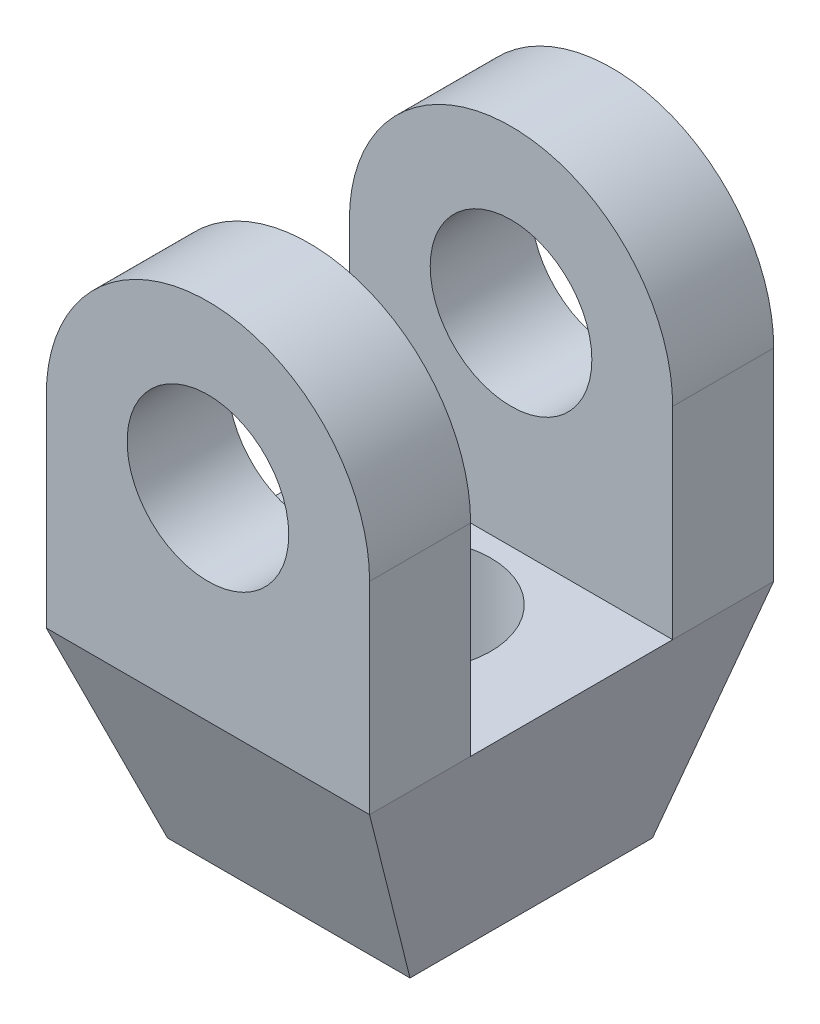
ISO-10303-21;
HEADER;
FILE_DESCRIPTION(('STEP AP214'),'2;1');
FILE_NAME('part.step','',(''),(''),'','','');
FILE_SCHEMA(('AUTOMOTIVE_DESIGN { 1 0 10303 214 1 1 1 1 }'));
ENDSEC;
DATA;
#1=APPLICATION_CONTEXT('core data for automotive mechanical design processes');
#2=APPLICATION_PROTOCOL_DEFINITION('international standard','automotive_design',2000,#1);
#3=PRODUCT_CONTEXT('',#1,'mechanical');
#4=PRODUCT('Part','Part','',(#3));
#5=PRODUCT_RELATED_PRODUCT_CATEGORY('part','',(#4));
#6=PRODUCT_DEFINITION_FORMATION('','',#4);
#7=PRODUCT_DEFINITION_CONTEXT('part definition',#1,'design');
#8=PRODUCT_DEFINITION('design','',#6,#7);
#9=PRODUCT_DEFINITION_SHAPE('','',#8);
#10=(LENGTH_UNIT() NAMED_UNIT(*) SI_UNIT(.MILLI.,.METRE.));
#11=(NAMED_UNIT(*) PLANE_ANGLE_UNIT() SI_UNIT($,.RADIAN.));
#12=(NAMED_UNIT(*) SI_UNIT($,.STERADIAN.) SOLID_ANGLE_UNIT());
#13=UNCERTAINTY_MEASURE_WITH_UNIT(LENGTH_MEASURE(1.E-05),#10,'distance_accuracy_value','');
#14=(GEOMETRIC_REPRESENTATION_CONTEXT(3) GLOBAL_UNCERTAINTY_ASSIGNED_CONTEXT((#13)) GLOBAL_UNIT_ASSIGNED_CONTEXT((#10,
#11,#12)) REPRESENTATION_CONTEXT('',''));
#15=CARTESIAN_POINT('',(0.,0.,0.));
#16=DIRECTION('',(0.,0.,1.));
#17=DIRECTION('',(1.,0.,0.));
#18=AXIS2_PLACEMENT_3D('',#15,#16,#17);
#19=CARTESIAN_POINT('',(4.,-7.5,3.));
#20=DIRECTION('',(0.,1.,0.));
#21=DIRECTION('',(0.,0.,1.));
#22=AXIS2_PLACEMENT_3D('',#19,#20,#21);
#23=PLANE('',#22);
#24=DIRECTION('',(0.,0.,1.));
#25=VECTOR('',#24,1.);
#26=CARTESIAN_POINT('',(-3.,-7.5,-5.));
#27=LINE('',#26,#25);
#28=CARTESIAN_POINT('',(-3.,-7.5,-3.));
#29=VERTEX_POINT('',#28);
#30=CARTESIAN_POINT('',(-3.,-7.5,3.));
#31=VERTEX_POINT('',#30);
#32=EDGE_CURVE('E290',#29,#31,#27,.T.);
#33=ORIENTED_EDGE('',*,*,#32,.F.);
#34=DIRECTION('',(-1.,0.,0.));
#35=VECTOR('',#34,1.);
#36=CARTESIAN_POINT('',(4.,-7.5,-3.));
#37=LINE('',#36,#35);
#38=CARTESIAN_POINT('',(3.,-7.5,-3.));
#39=VERTEX_POINT('',#38);
#40=EDGE_CURVE('E145',#39,#29,#37,.T.);
#41=ORIENTED_EDGE('',*,*,#40,.F.);
#42=DIRECTION('',(0.,0.,1.));
#43=VECTOR('',#42,1.);
#44=CARTESIAN_POINT('',(3.,-7.5,-5.));
#45=LINE('',#44,#43);
#46=CARTESIAN_POINT('',(3.,-7.5,3.));
#47=VERTEX_POINT('',#46);
#48=EDGE_CURVE('E59',#39,#47,#45,.T.);
#49=ORIENTED_EDGE('',*,*,#48,.T.);
#50=DIRECTION('',(-1.,0.,0.));
#51=VECTOR('',#50,1.);
#52=CARTESIAN_POINT('',(4.,-7.5,3.));
#53=LINE('',#52,#51);
#54=EDGE_CURVE('E180',#47,#31,#53,.T.);
#55=ORIENTED_EDGE('',*,*,#54,.T.);
#56=EDGE_LOOP('',(#33,#41,#49,#55));
#57=FACE_BOUND('',#56,.T.);
#58=CARTESIAN_POINT('',(0.,-7.500012,0.));
#59=DIRECTION('',(0.,-1.,0.));
#60=DIRECTION('',(0.,0.,-1.));
#61=AXIS2_PLACEMENT_3D('',#58,#59,#60);
#62=CIRCLE('',#61,2.);
#63=CARTESIAN_POINT('',(0.,-7.500012,-2.));
#64=VERTEX_POINT('',#63);
#65=EDGE_CURVE('E451',#64,#64,#62,.T.);
#66=ORIENTED_EDGE('',*,*,#65,.F.);
#67=EDGE_LOOP('',(#66));
#68=FACE_BOUND('',#67,.T.);
#69=ADVANCED_FACE('F39',(#57,#68),#23,.F.);
#70=CARTESIAN_POINT('',(4.,0.,0.));
#71=DIRECTION('',(-1.,0.,0.));
#72=DIRECTION('',(0.,0.,1.));
#73=AXIS2_PLACEMENT_3D('',#70,#71,#72);
#74=PLANE('',#73);
#75=DIRECTION('',(0.,0.,1.));
#76=VECTOR('',#75,1.);
#77=CARTESIAN_POINT('',(4.,-2.5,-5.));
#78=LINE('',#77,#76);
#79=CARTESIAN_POINT('',(4.,-2.5,-5.));
#80=VERTEX_POINT('',#79);
#81=CARTESIAN_POINT('',(4.,-2.5,-2.5));
#82=VERTEX_POINT('',#81);
#83=EDGE_CURVE('E116',#80,#82,#78,.T.);
#84=ORIENTED_EDGE('',*,*,#83,.F.);
#85=DIRECTION('',(0.,1.,0.));
#86=VECTOR('',#85,1.);
#87=CARTESIAN_POINT('',(4.,-2.5,-5.));
#88=LINE('',#87,#86);
#89=CARTESIAN_POINT('',(4.,2.5,-5.));
#90=VERTEX_POINT('',#89);
#91=EDGE_CURVE('E135',#80,#90,#88,.T.);
#92=ORIENTED_EDGE('',*,*,#91,.T.);
#93=DIRECTION('',(0.,0.,1.));
#94=VECTOR('',#93,1.);
#95=CARTESIAN_POINT('',(4.,2.5,-5.));
#96=LINE('',#95,#94);
#97=CARTESIAN_POINT('',(4.,2.5,-2.5));
#98=VERTEX_POINT('',#97);
#99=EDGE_CURVE('E280',#90,#98,#96,.T.);
#100=ORIENTED_EDGE('',*,*,#99,.T.);
#101=DIRECTION('',(0.,-1.,0.));
#102=VECTOR('',#101,1.);
#103=CARTESIAN_POINT('',(4.,7.5,-2.5));
#104=LINE('',#103,#102);
#105=EDGE_CURVE('E131',#98,#82,#104,.T.);
#106=ORIENTED_EDGE('',*,*,#105,.T.);
#107=EDGE_LOOP('',(#84,#92,#100,#106));
#108=FACE_BOUND('',#107,.T.);
#109=ADVANCED_FACE('F129',(#108),#74,.F.);
#110=CARTESIAN_POINT('',(4.,-2.5,2.5));
#111=VERTEX_POINT('',#110);
#112=CARTESIAN_POINT('',(4.,-2.5,5.));
#113=VERTEX_POINT('',#112);
#114=EDGE_CURVE('E124',#111,#113,#78,.T.);
#115=ORIENTED_EDGE('',*,*,#114,.F.);
#116=DIRECTION('',(0.,1.,0.));
#117=VECTOR('',#116,1.);
#118=CARTESIAN_POINT('',(4.,7.5,2.5));
#119=LINE('',#118,#117);
#120=CARTESIAN_POINT('',(4.,2.5,2.5));
#121=VERTEX_POINT('',#120);
#122=EDGE_CURVE('E161',#111,#121,#119,.T.);
#123=ORIENTED_EDGE('',*,*,#122,.T.);
#124=CARTESIAN_POINT('',(4.,2.5,5.));
#125=VERTEX_POINT('',#124);
#126=EDGE_CURVE('E68',#121,#125,#96,.T.);
#127=ORIENTED_EDGE('',*,*,#126,.T.);
#128=DIRECTION('',(0.,-1.,0.));
#129=VECTOR('',#128,1.);
#130=CARTESIAN_POINT('',(4.,-2.5,5.));
#131=LINE('',#130,#129);
#132=EDGE_CURVE('E144',#125,#113,#131,.T.);
#133=ORIENTED_EDGE('',*,*,#132,.T.);
#134=EDGE_LOOP('',(#115,#123,#127,#133));
#135=FACE_BOUND('',#134,.T.);
#136=ADVANCED_FACE('F237',(#135),#74,.F.);
#137=CARTESIAN_POINT('',(-4.,0.,0.));
#138=DIRECTION('',(-1.,0.,0.));
#139=DIRECTION('',(0.,0.,1.));
#140=AXIS2_PLACEMENT_3D('',#137,#138,#139);
#141=PLANE('',#140);
#142=DIRECTION('',(0.,1.,0.));
#143=VECTOR('',#142,1.);
#144=CARTESIAN_POINT('',(-4.,-2.5,-5.));
#145=LINE('',#144,#143);
#146=CARTESIAN_POINT('',(-4.,-2.5,-5.));
#147=VERTEX_POINT('',#146);
#148=CARTESIAN_POINT('',(-4.,2.5,-5.));
#149=VERTEX_POINT('',#148);
#150=EDGE_CURVE('E167',#147,#149,#145,.T.);
#151=ORIENTED_EDGE('',*,*,#150,.F.);
#152=DIRECTION('',(0.,0.,1.));
#153=VECTOR('',#152,1.);
#154=CARTESIAN_POINT('',(-4.,-2.5,-5.));
#155=LINE('',#154,#153);
#156=CARTESIAN_POINT('',(-4.,-2.5,-2.5));
#157=VERTEX_POINT('',#156);
#158=EDGE_CURVE('E138',#147,#157,#155,.T.);
#159=ORIENTED_EDGE('',*,*,#158,.T.);
#160=DIRECTION('',(0.,-1.,0.));
#161=VECTOR('',#160,1.);
#162=CARTESIAN_POINT('',(-4.,7.5,-2.5));
#163=LINE('',#162,#161);
#164=CARTESIAN_POINT('',(-4.,2.5,-2.5));
#165=VERTEX_POINT('',#164);
#166=EDGE_CURVE('E169',#165,#157,#163,.T.);
#167=ORIENTED_EDGE('',*,*,#166,.F.);
#168=DIRECTION('',(0.,0.,1.));
#169=VECTOR('',#168,1.);
#170=CARTESIAN_POINT('',(-4.,2.5,-5.));
#171=LINE('',#170,#169);
#172=EDGE_CURVE('E277',#149,#165,#171,.T.);
#173=ORIENTED_EDGE('',*,*,#172,.F.);
#174=EDGE_LOOP('',(#151,#159,#167,#173));
#175=FACE_BOUND('',#174,.T.);
#176=ADVANCED_FACE('F243',(#175),#141,.T.);
#177=DIRECTION('',(0.,1.,0.));
#178=VECTOR('',#177,1.);
#179=CARTESIAN_POINT('',(-4.,7.5,2.5));
#180=LINE('',#179,#178);
#181=CARTESIAN_POINT('',(-4.,-2.5,2.5));
#182=VERTEX_POINT('',#181);
#183=CARTESIAN_POINT('',(-4.,2.5,2.5));
#184=VERTEX_POINT('',#183);
#185=EDGE_CURVE('E152',#182,#184,#180,.T.);
#186=ORIENTED_EDGE('',*,*,#185,.F.);
#187=CARTESIAN_POINT('',(-4.,-2.5,5.));
#188=VERTEX_POINT('',#187);
#189=EDGE_CURVE('E295',#182,#188,#155,.T.);
#190=ORIENTED_EDGE('',*,*,#189,.T.);
#191=DIRECTION('',(0.,-1.,0.));
#192=VECTOR('',#191,1.);
#193=CARTESIAN_POINT('',(-4.,-2.5,5.));
#194=LINE('',#193,#192);
#195=CARTESIAN_POINT('',(-4.,2.5,5.));
#196=VERTEX_POINT('',#195);
#197=EDGE_CURVE('E149',#196,#188,#194,.T.);
#198=ORIENTED_EDGE('',*,*,#197,.F.);
#199=EDGE_CURVE('E186',#184,#196,#171,.T.);
#200=ORIENTED_EDGE('',*,*,#199,.F.);
#201=EDGE_LOOP('',(#186,#190,#198,#200));
#202=FACE_BOUND('',#201,.T.);
#203=ADVANCED_FACE('F215',(#202),#141,.T.);
#204=CARTESIAN_POINT('',(4.,-2.5,5.));
#205=DIRECTION('',(0.,0.,-1.));
#206=DIRECTION('',(-1.,0.,0.));
#207=AXIS2_PLACEMENT_3D('',#204,#205,#206);
#208=PLANE('',#207);
#209=CARTESIAN_POINT('',(0.,2.5,5.000012));
#210=DIRECTION('',(0.,0.,1.));
#211=DIRECTION('',(1.,0.,0.));
#212=AXIS2_PLACEMENT_3D('',#209,#210,#211);
#213=CIRCLE('',#212,2.);
#214=CARTESIAN_POINT('',(2.,2.5,5.000012));
#215=VERTEX_POINT('',#214);
#216=EDGE_CURVE('E196',#215,#215,#213,.T.);
#217=ORIENTED_EDGE('',*,*,#216,.F.);
#218=EDGE_LOOP('',(#217));
#219=FACE_BOUND('',#218,.T.);
#220=ORIENTED_EDGE('',*,*,#132,.F.);
#221=CARTESIAN_POINT('',(0.,2.5,5.));
#222=DIRECTION('',(0.,0.,-1.));
#223=DIRECTION('',(-1.,0.,0.));
#224=AXIS2_PLACEMENT_3D('',#221,#222,#223);
#225=CIRCLE('',#224,4.);
#226=EDGE_CURVE('E268',#125,#196,#225,.F.);
#227=ORIENTED_EDGE('',*,*,#226,.T.);
#228=ORIENTED_EDGE('',*,*,#197,.T.);
#229=DIRECTION('',(-1.,0.,0.));
#230=VECTOR('',#229,1.);
#231=CARTESIAN_POINT('',(4.,-2.5,5.));
#232=LINE('',#231,#230);
#233=EDGE_CURVE('E179',#113,#188,#232,.T.);
#234=ORIENTED_EDGE('',*,*,#233,.F.);
#235=EDGE_LOOP('',(#220,#227,#228,#234));
#236=FACE_BOUND('',#235,.T.);
#237=ADVANCED_FACE('F205',(#219,#236),#208,.F.);
#238=CARTESIAN_POINT('',(4.,-2.5,-5.));
#239=DIRECTION('',(0.,0.,1.));
#240=DIRECTION('',(1.,0.,0.));
#241=AXIS2_PLACEMENT_3D('',#238,#239,#240);
#242=PLANE('',#241);
#243=CARTESIAN_POINT('',(0.,2.5,-5.));
#244=DIRECTION('',(0.,0.,1.));
#245=DIRECTION('',(1.,0.,0.));
#246=AXIS2_PLACEMENT_3D('',#243,#244,#245);
#247=CIRCLE('',#246,2.);
#248=CARTESIAN_POINT('',(2.,2.5,-5.));
#249=VERTEX_POINT('',#248);
#250=EDGE_CURVE('E191',#249,#249,#247,.T.);
#251=ORIENTED_EDGE('',*,*,#250,.T.);
#252=EDGE_LOOP('',(#251));
#253=FACE_BOUND('',#252,.T.);
#254=ORIENTED_EDGE('',*,*,#150,.T.);
#255=CARTESIAN_POINT('',(0.,2.5,-5.));
#256=DIRECTION('',(0.,0.,-1.));
#257=DIRECTION('',(1.,0.,0.));
#258=AXIS2_PLACEMENT_3D('',#255,#256,#257);
#259=CIRCLE('',#258,4.);
#260=EDGE_CURVE('E146',#149,#90,#259,.T.);
#261=ORIENTED_EDGE('',*,*,#260,.T.);
#262=ORIENTED_EDGE('',*,*,#91,.F.);
#263=DIRECTION('',(-1.,0.,0.));
#264=VECTOR('',#263,1.);
#265=CARTESIAN_POINT('',(4.,-2.5,-5.));
#266=LINE('',#265,#264);
#267=EDGE_CURVE('E137',#80,#147,#266,.T.);
#268=ORIENTED_EDGE('',*,*,#267,.T.);
#269=EDGE_LOOP('',(#254,#261,#262,#268));
#270=FACE_BOUND('',#269,.T.);
#271=ADVANCED_FACE('F41',(#253,#270),#242,.F.);
#272=CARTESIAN_POINT('',(4.,7.5,-2.5));
#273=DIRECTION('',(0.,0.,-1.));
#274=DIRECTION('',(0.,1.,0.));
#275=AXIS2_PLACEMENT_3D('',#272,#273,#274);
#276=PLANE('',#275);
#277=CARTESIAN_POINT('',(0.,2.5,-2.5));
#278=DIRECTION('',(0.,0.,-1.));
#279=DIRECTION('',(0.,1.,0.));
#280=AXIS2_PLACEMENT_3D('',#277,#278,#279);
#281=CIRCLE('',#280,2.);
#282=CARTESIAN_POINT('',(0.,4.5,-2.5));
#283=VERTEX_POINT('',#282);
#284=EDGE_CURVE('E160',#283,#283,#281,.T.);
#285=ORIENTED_EDGE('',*,*,#284,.T.);
#286=EDGE_LOOP('',(#285));
#287=FACE_BOUND('',#286,.T.);
#288=ORIENTED_EDGE('',*,*,#105,.F.);
#289=CARTESIAN_POINT('',(0.,2.5,-2.5));
#290=DIRECTION('',(0.,0.,-1.));
#291=DIRECTION('',(0.,1.,0.));
#292=AXIS2_PLACEMENT_3D('',#289,#290,#291);
#293=CIRCLE('',#292,4.);
#294=EDGE_CURVE('E271',#98,#165,#293,.F.);
#295=ORIENTED_EDGE('',*,*,#294,.T.);
#296=ORIENTED_EDGE('',*,*,#166,.T.);
#297=DIRECTION('',(-1.,0.,0.));
#298=VECTOR('',#297,1.);
#299=CARTESIAN_POINT('',(4.,-2.5,-2.5));
#300=LINE('',#299,#298);
#301=EDGE_CURVE('E187',#82,#157,#300,.T.);
#302=ORIENTED_EDGE('',*,*,#301,.F.);
#303=EDGE_LOOP('',(#288,#295,#296,#302));
#304=FACE_BOUND('',#303,.T.);
#305=ADVANCED_FACE('F217',(#287,#304),#276,.F.);
#306=CARTESIAN_POINT('',(4.,7.5,2.5));
#307=DIRECTION('',(0.,0.,1.));
#308=DIRECTION('',(0.,-1.,0.));
#309=AXIS2_PLACEMENT_3D('',#306,#307,#308);
#310=PLANE('',#309);
#311=CARTESIAN_POINT('',(0.,2.5,2.5));
#312=DIRECTION('',(0.,0.,1.));
#313=DIRECTION('',(0.,-1.,0.));
#314=AXIS2_PLACEMENT_3D('',#311,#312,#313);
#315=CIRCLE('',#314,2.);
#316=CARTESIAN_POINT('',(0.,0.499999999999999,2.5));
#317=VERTEX_POINT('',#316);
#318=EDGE_CURVE('E188',#317,#317,#315,.T.);
#319=ORIENTED_EDGE('',*,*,#318,.T.);
#320=EDGE_LOOP('',(#319));
#321=FACE_BOUND('',#320,.T.);
#322=ORIENTED_EDGE('',*,*,#185,.T.);
#323=CARTESIAN_POINT('',(0.,2.5,2.5));
#324=DIRECTION('',(0.,0.,1.));
#325=DIRECTION('',(0.,-1.,0.));
#326=AXIS2_PLACEMENT_3D('',#323,#324,#325);
#327=CIRCLE('',#326,4.);
#328=EDGE_CURVE('E273',#184,#121,#327,.F.);
#329=ORIENTED_EDGE('',*,*,#328,.T.);
#330=ORIENTED_EDGE('',*,*,#122,.F.);
#331=DIRECTION('',(-1.,0.,0.));
#332=VECTOR('',#331,1.);
#333=CARTESIAN_POINT('',(4.,-2.5,2.5));
#334=LINE('',#333,#332);
#335=EDGE_CURVE('E181',#111,#182,#334,.T.);
#336=ORIENTED_EDGE('',*,*,#335,.T.);
#337=EDGE_LOOP('',(#322,#329,#330,#336));
#338=FACE_BOUND('',#337,.T.);
#339=ADVANCED_FACE('F212',(#321,#338),#310,.F.);
#340=CARTESIAN_POINT('',(4.,-2.5,2.5));
#341=DIRECTION('',(0.,-1.,0.));
#342=DIRECTION('',(0.,0.,-1.));
#343=AXIS2_PLACEMENT_3D('',#340,#341,#342);
#344=PLANE('',#343);
#345=CARTESIAN_POINT('',(0.,-2.5,0.));
#346=DIRECTION('',(0.,-1.,0.));
#347=DIRECTION('',(0.,0.,-1.));
#348=AXIS2_PLACEMENT_3D('',#345,#346,#347);
#349=CIRCLE('',#348,2.);
#350=CARTESIAN_POINT('',(0.,-2.5,-2.));
#351=VERTEX_POINT('',#350);
#352=EDGE_CURVE('E286',#351,#351,#349,.T.);
#353=ORIENTED_EDGE('',*,*,#352,.T.);
#354=EDGE_LOOP('',(#353));
#355=FACE_BOUND('',#354,.T.);
#356=DIRECTION('',(0.,0.,1.));
#357=VECTOR('',#356,1.);
#358=CARTESIAN_POINT('',(-4.,-2.5,2.5));
#359=LINE('',#358,#357);
#360=EDGE_CURVE('E172',#157,#182,#359,.T.);
#361=ORIENTED_EDGE('',*,*,#360,.T.);
#362=ORIENTED_EDGE('',*,*,#335,.F.);
#363=DIRECTION('',(0.,0.,1.));
#364=VECTOR('',#363,1.);
#365=CARTESIAN_POINT('',(4.,-2.5,2.5));
#366=LINE('',#365,#364);
#367=EDGE_CURVE('E151',#82,#111,#366,.T.);
#368=ORIENTED_EDGE('',*,*,#367,.F.);
#369=ORIENTED_EDGE('',*,*,#301,.T.);
#370=EDGE_LOOP('',(#361,#362,#368,#369));
#371=FACE_BOUND('',#370,.T.);
#372=ADVANCED_FACE('F220',(#355,#371),#344,.F.);
#373=CARTESIAN_POINT('',(4.,-7.5,3.));
#374=DIRECTION('',(0.,0.371390676354104,-0.928476690885259));
#375=DIRECTION('',(0.,0.928476690885259,0.371390676354104));
#376=AXIS2_PLACEMENT_3D('',#373,#374,#375);
#377=PLANE('',#376);
#378=ORIENTED_EDGE('',*,*,#233,.T.);
#379=DIRECTION('',(0.182574185835055,-0.912870929175277,-0.365148371670111));
#380=VECTOR('',#379,1.);
#381=CARTESIAN_POINT('',(-2.76666666666667,-8.66666666666667,2.53333333333333));
#382=LINE('',#381,#380);
#383=EDGE_CURVE('E282',#188,#31,#382,.T.);
#384=ORIENTED_EDGE('',*,*,#383,.T.);
#385=ORIENTED_EDGE('',*,*,#54,.F.);
#386=DIRECTION('',(0.182574185835055,0.912870929175277,0.365148371670111));
#387=VECTOR('',#386,1.);
#388=CARTESIAN_POINT('',(3.03333333333333,-7.33333333333333,3.06666666666667));
#389=LINE('',#388,#387);
#390=EDGE_CURVE('E281',#47,#113,#389,.T.);
#391=ORIENTED_EDGE('',*,*,#390,.T.);
#392=EDGE_LOOP('',(#378,#384,#385,#391));
#393=FACE_BOUND('',#392,.T.);
#394=ADVANCED_FACE('F213',(#393),#377,.F.);
#395=CARTESIAN_POINT('',(4.,-7.5,-3.));
#396=DIRECTION('',(0.,0.371390676354104,0.92847669088526));
#397=DIRECTION('',(0.,-0.928476690885259,0.371390676354104));
#398=AXIS2_PLACEMENT_3D('',#395,#396,#397);
#399=PLANE('',#398);
#400=ORIENTED_EDGE('',*,*,#40,.T.);
#401=DIRECTION('',(-0.182574185835055,0.912870929175277,-0.365148371670111));
#402=VECTOR('',#401,1.);
#403=CARTESIAN_POINT('',(-2.76666666666667,-8.66666666666667,-2.53333333333333));
#404=LINE('',#403,#402);
#405=EDGE_CURVE('E11',#29,#147,#404,.T.);
#406=ORIENTED_EDGE('',*,*,#405,.T.);
#407=ORIENTED_EDGE('',*,*,#267,.F.);
#408=DIRECTION('',(-0.182574185835055,-0.912870929175277,0.365148371670111));
#409=VECTOR('',#408,1.);
#410=CARTESIAN_POINT('',(3.03333333333333,-7.33333333333333,-3.06666666666667));
#411=LINE('',#410,#409);
#412=EDGE_CURVE('E49',#80,#39,#411,.T.);
#413=ORIENTED_EDGE('',*,*,#412,.T.);
#414=EDGE_LOOP('',(#400,#406,#407,#413));
#415=FACE_BOUND('',#414,.T.);
#416=ADVANCED_FACE('F139',(#415),#399,.F.);
#417=CARTESIAN_POINT('',(0.,2.5,-5.));
#418=DIRECTION('',(0.,0.,1.));
#419=DIRECTION('',(1.,0.,0.));
#420=AXIS2_PLACEMENT_3D('',#417,#418,#419);
#421=CYLINDRICAL_SURFACE('',#420,2.);
#422=ORIENTED_EDGE('',*,*,#216,.T.);
#423=EDGE_LOOP('',(#422));
#424=FACE_BOUND('',#423,.T.);
#425=ORIENTED_EDGE('',*,*,#318,.F.);
#426=EDGE_LOOP('',(#425));
#427=FACE_BOUND('',#426,.T.);
#428=ADVANCED_FACE('F241',(#424,#427),#421,.F.);
#429=ORIENTED_EDGE('',*,*,#250,.F.);
#430=EDGE_LOOP('',(#429));
#431=FACE_BOUND('',#430,.T.);
#432=ORIENTED_EDGE('',*,*,#284,.F.);
#433=EDGE_LOOP('',(#432));
#434=FACE_BOUND('',#433,.T.);
#435=ADVANCED_FACE('F247',(#431,#434),#421,.F.);
#436=CARTESIAN_POINT('',(0.,2.5,-5.));
#437=DIRECTION('',(0.,0.,1.));
#438=DIRECTION('',(1.,0.,0.));
#439=AXIS2_PLACEMENT_3D('',#436,#437,#438);
#440=CYLINDRICAL_SURFACE('',#439,4.);
#441=ORIENTED_EDGE('',*,*,#126,.F.);
#442=ORIENTED_EDGE('',*,*,#328,.F.);
#443=ORIENTED_EDGE('',*,*,#199,.T.);
#444=ORIENTED_EDGE('',*,*,#226,.F.);
#445=EDGE_LOOP('',(#441,#442,#443,#444));
#446=FACE_BOUND('',#445,.T.);
#447=ADVANCED_FACE('F251',(#446),#440,.T.);
#448=ORIENTED_EDGE('',*,*,#99,.F.);
#449=ORIENTED_EDGE('',*,*,#260,.F.);
#450=ORIENTED_EDGE('',*,*,#172,.T.);
#451=ORIENTED_EDGE('',*,*,#294,.F.);
#452=EDGE_LOOP('',(#448,#449,#450,#451));
#453=FACE_BOUND('',#452,.T.);
#454=ADVANCED_FACE('F315',(#453),#440,.T.);
#455=CARTESIAN_POINT('',(3.,-7.5,-5.));
#456=DIRECTION('',(-0.98058067569092,0.196116135138184,0.));
#457=DIRECTION('',(-0.196116135138184,-0.98058067569092,0.));
#458=AXIS2_PLACEMENT_3D('',#455,#456,#457);
#459=PLANE('',#458);
#460=ORIENTED_EDGE('',*,*,#48,.F.);
#461=ORIENTED_EDGE('',*,*,#412,.F.);
#462=ORIENTED_EDGE('',*,*,#83,.T.);
#463=ORIENTED_EDGE('',*,*,#367,.T.);
#464=ORIENTED_EDGE('',*,*,#114,.T.);
#465=ORIENTED_EDGE('',*,*,#390,.F.);
#466=EDGE_LOOP('',(#460,#461,#462,#463,#464,#465));
#467=FACE_BOUND('',#466,.T.);
#468=ADVANCED_FACE('F119',(#467),#459,.F.);
#469=CARTESIAN_POINT('',(-3.,-7.5,-5.));
#470=DIRECTION('',(0.98058067569092,0.196116135138184,0.));
#471=DIRECTION('',(-0.196116135138184,0.98058067569092,0.));
#472=AXIS2_PLACEMENT_3D('',#469,#470,#471);
#473=PLANE('',#472);
#474=ORIENTED_EDGE('',*,*,#189,.F.);
#475=ORIENTED_EDGE('',*,*,#360,.F.);
#476=ORIENTED_EDGE('',*,*,#158,.F.);
#477=ORIENTED_EDGE('',*,*,#405,.F.);
#478=ORIENTED_EDGE('',*,*,#32,.T.);
#479=ORIENTED_EDGE('',*,*,#383,.F.);
#480=EDGE_LOOP('',(#474,#475,#476,#477,#478,#479));
#481=FACE_BOUND('',#480,.T.);
#482=ADVANCED_FACE('F306',(#481),#473,.F.);
#483=CARTESIAN_POINT('',(0.,6.5,0.));
#484=DIRECTION('',(0.,-1.,0.));
#485=DIRECTION('',(0.,0.,-1.));
#486=AXIS2_PLACEMENT_3D('',#483,#484,#485);
#487=CYLINDRICAL_SURFACE('',#486,2.);
#488=ORIENTED_EDGE('',*,*,#65,.T.);
#489=EDGE_LOOP('',(#488));
#490=FACE_BOUND('',#489,.T.);
#491=ORIENTED_EDGE('',*,*,#352,.F.);
#492=EDGE_LOOP('',(#491));
#493=FACE_BOUND('',#492,.T.);
#494=ADVANCED_FACE('F296',(#490,#493),#487,.F.);
#495=CLOSED_SHELL('',(#69,#109,#136,#176,#203,#237,#271,#305,#339,#372,#394,#416,#428,#435,#447,
#454,#468,#482,#494));
#496=MANIFOLD_SOLID_BREP('B2',#495);
#497=ADVANCED_BREP_SHAPE_REPRESENTATION('',(#18,#496),#14);
#498=SHAPE_DEFINITION_REPRESENTATION(#9,#497);
ENDSEC;
END-ISO-10303-21;
